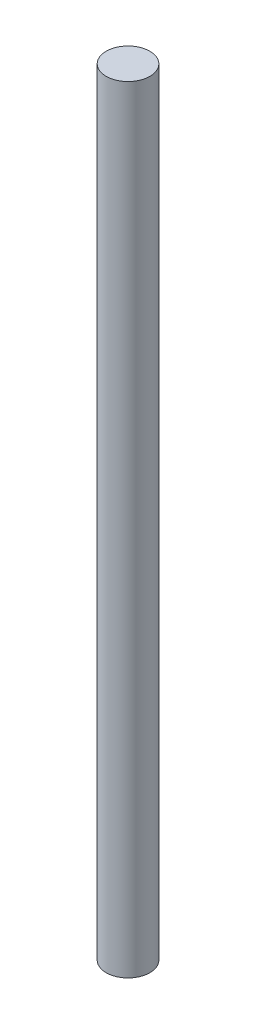
ISO-10303-21;
HEADER;
FILE_DESCRIPTION(('STEP AP214'),'2;1');
FILE_NAME('part.step','',(''),(''),'','','');
FILE_SCHEMA(('AUTOMOTIVE_DESIGN { 1 0 10303 214 1 1 1 1 }'));
ENDSEC;
DATA;
#1=APPLICATION_CONTEXT('core data for automotive mechanical design processes');
#2=APPLICATION_PROTOCOL_DEFINITION('international standard','automotive_design',2000,#1);
#3=PRODUCT_CONTEXT('',#1,'mechanical');
#4=PRODUCT('Part','Part','',(#3));
#5=PRODUCT_RELATED_PRODUCT_CATEGORY('part','',(#4));
#6=PRODUCT_DEFINITION_FORMATION('','',#4);
#7=PRODUCT_DEFINITION_CONTEXT('part definition',#1,'design');
#8=PRODUCT_DEFINITION('design','',#6,#7);
#9=PRODUCT_DEFINITION_SHAPE('','',#8);
#10=(LENGTH_UNIT() NAMED_UNIT(*) SI_UNIT(.MILLI.,.METRE.));
#11=(NAMED_UNIT(*) PLANE_ANGLE_UNIT() SI_UNIT($,.RADIAN.));
#12=(NAMED_UNIT(*) SI_UNIT($,.STERADIAN.) SOLID_ANGLE_UNIT());
#13=UNCERTAINTY_MEASURE_WITH_UNIT(LENGTH_MEASURE(1.E-05),#10,'distance_accuracy_value','');
#14=(GEOMETRIC_REPRESENTATION_CONTEXT(3) GLOBAL_UNCERTAINTY_ASSIGNED_CONTEXT((#13)) GLOBAL_UNIT_ASSIGNED_CONTEXT((#10,
#11,#12)) REPRESENTATION_CONTEXT('',''));
#15=CARTESIAN_POINT('',(0.,0.,0.));
#16=DIRECTION('',(0.,0.,1.));
#17=DIRECTION('',(1.,0.,0.));
#18=AXIS2_PLACEMENT_3D('',#15,#16,#17);
#19=CARTESIAN_POINT('',(0.,113.03,0.));
#20=DIRECTION('',(0.,-1.,0.));
#21=DIRECTION('',(0.,0.,-1.));
#22=AXIS2_PLACEMENT_3D('',#19,#20,#21);
#23=CYLINDRICAL_SURFACE('',#22,3.175);
#24=CARTESIAN_POINT('',(0.,113.03,0.));
#25=DIRECTION('',(0.,1.,0.));
#26=DIRECTION('',(0.,0.,1.));
#27=AXIS2_PLACEMENT_3D('',#24,#25,#26);
#28=CIRCLE('',#27,3.175);
#29=CARTESIAN_POINT('',(0.,113.03,-3.175));
#30=VERTEX_POINT('',#29);
#31=EDGE_CURVE('E10',#30,#30,#28,.T.);
#32=CARTESIAN_POINT('',(0.,0.,0.));
#33=DIRECTION('',(0.,1.,0.));
#34=DIRECTION('',(0.,0.,1.));
#35=AXIS2_PLACEMENT_3D('',#32,#33,#34);
#36=CIRCLE('',#35,3.175);
#37=CARTESIAN_POINT('',(0.,0.,-3.175));
#38=VERTEX_POINT('',#37);
#39=EDGE_CURVE('E44',#38,#38,#36,.T.);
#40=CARTESIAN_POINT('',(0.,113.03,-3.175));
#41=CARTESIAN_POINT('',(0.,111.852604166667,-3.175));
#42=CARTESIAN_POINT('',(0.,110.675208333333,-3.175));
#43=CARTESIAN_POINT('',(0.,108.320416666667,-3.175));
#44=CARTESIAN_POINT('',(0.,107.143020833333,-3.175));
#45=CARTESIAN_POINT('',(0.,104.788229166667,-3.175));
#46=CARTESIAN_POINT('',(0.,103.610833333333,-3.175));
#47=CARTESIAN_POINT('',(0.,101.256041666667,-3.175));
#48=CARTESIAN_POINT('',(0.,100.078645833333,-3.175));
#49=CARTESIAN_POINT('',(0.,97.7238541666667,-3.175));
#50=CARTESIAN_POINT('',(0.,96.5464583333333,-3.175));
#51=CARTESIAN_POINT('',(0.,94.1916666666667,-3.175));
#52=CARTESIAN_POINT('',(0.,93.0142708333333,-3.175));
#53=CARTESIAN_POINT('',(0.,90.6594791666667,-3.175));
#54=CARTESIAN_POINT('',(0.,89.4820833333333,-3.175));
#55=CARTESIAN_POINT('',(0.,87.1272916666667,-3.175));
#56=CARTESIAN_POINT('',(0.,85.9498958333333,-3.175));
#57=CARTESIAN_POINT('',(0.,83.5951041666667,-3.175));
#58=CARTESIAN_POINT('',(0.,82.4177083333333,-3.175));
#59=CARTESIAN_POINT('',(0.,80.0629166666667,-3.175));
#60=CARTESIAN_POINT('',(0.,78.8855208333333,-3.175));
#61=CARTESIAN_POINT('',(0.,76.5307291666667,-3.175));
#62=CARTESIAN_POINT('',(0.,75.3533333333333,-3.175));
#63=CARTESIAN_POINT('',(0.,72.9985416666667,-3.175));
#64=CARTESIAN_POINT('',(0.,71.8211458333333,-3.175));
#65=CARTESIAN_POINT('',(0.,69.4663541666667,-3.175));
#66=CARTESIAN_POINT('',(0.,68.2889583333333,-3.175));
#67=CARTESIAN_POINT('',(0.,65.9341666666667,-3.175));
#68=CARTESIAN_POINT('',(0.,64.7567708333333,-3.175));
#69=CARTESIAN_POINT('',(0.,62.4019791666667,-3.175));
#70=CARTESIAN_POINT('',(0.,61.2245833333333,-3.175));
#71=CARTESIAN_POINT('',(0.,58.8697916666667,-3.175));
#72=CARTESIAN_POINT('',(0.,57.6923958333333,-3.175));
#73=CARTESIAN_POINT('',(0.,55.3376041666667,-3.175));
#74=CARTESIAN_POINT('',(0.,54.1602083333333,-3.175));
#75=CARTESIAN_POINT('',(0.,51.8054166666667,-3.175));
#76=CARTESIAN_POINT('',(0.,50.6280208333333,-3.175));
#77=CARTESIAN_POINT('',(0.,48.2732291666667,-3.175));
#78=CARTESIAN_POINT('',(0.,47.0958333333333,-3.175));
#79=CARTESIAN_POINT('',(0.,44.7410416666667,-3.175));
#80=CARTESIAN_POINT('',(0.,43.5636458333333,-3.175));
#81=CARTESIAN_POINT('',(0.,41.2088541666667,-3.175));
#82=CARTESIAN_POINT('',(0.,40.0314583333333,-3.175));
#83=CARTESIAN_POINT('',(0.,37.6766666666667,-3.175));
#84=CARTESIAN_POINT('',(0.,36.4992708333333,-3.175));
#85=CARTESIAN_POINT('',(0.,34.1444791666667,-3.175));
#86=CARTESIAN_POINT('',(0.,32.9670833333333,-3.175));
#87=CARTESIAN_POINT('',(0.,30.6122916666667,-3.175));
#88=CARTESIAN_POINT('',(0.,29.4348958333333,-3.175));
#89=CARTESIAN_POINT('',(0.,27.0801041666667,-3.175));
#90=CARTESIAN_POINT('',(0.,25.9027083333333,-3.175));
#91=CARTESIAN_POINT('',(0.,23.5479166666667,-3.175));
#92=CARTESIAN_POINT('',(0.,22.3705208333333,-3.175));
#93=CARTESIAN_POINT('',(0.,20.0157291666667,-3.175));
#94=CARTESIAN_POINT('',(0.,18.8383333333333,-3.175));
#95=CARTESIAN_POINT('',(0.,16.4835416666667,-3.175));
#96=CARTESIAN_POINT('',(0.,15.3061458333333,-3.175));
#97=CARTESIAN_POINT('',(0.,12.9513541666667,-3.175));
#98=CARTESIAN_POINT('',(0.,11.7739583333333,-3.175));
#99=CARTESIAN_POINT('',(0.,9.41916666666667,-3.175));
#100=CARTESIAN_POINT('',(0.,8.24177083333333,-3.175));
#101=CARTESIAN_POINT('',(0.,5.88697916666667,-3.175));
#102=CARTESIAN_POINT('',(0.,4.70958333333334,-3.175));
#103=CARTESIAN_POINT('',(0.,2.35479166666667,-3.175));
#104=CARTESIAN_POINT('',(0.,1.17739583333333,-3.175));
#105=CARTESIAN_POINT('',(0.,0.,-3.175));
#106=B_SPLINE_CURVE_WITH_KNOTS('',3,(#40,#41,#42,#43,#44,#45,#46,#47,#48,#49,#50,#51,#52,#53,
#54,#55,#56,#57,#58,#59,#60,#61,#62,#63,#64,#65,#66,#67,#68,#69,#70,#71,#72,#73,#74,#75,#76,#77,
#78,#79,#80,#81,#82,#83,#84,#85,#86,#87,#88,#89,#90,#91,#92,#93,#94,#95,#96,#97,#98,#99,#100,
#101,#102,#103,#104,#105),.UNSPECIFIED.,.F.,.F.,(4,2,2,2,2,2,2,2,2,2,2,2,2,2,2,2,2,2,2,2,2,2,2,
2,2,2,2,2,2,2,2,2,4),(0.,3.53218750000001,7.06437500000001,10.5965625,14.12875,17.6609375,
21.193125,24.7253125,28.2575,31.7896875,35.321875,38.8540625,42.38625,45.9184375,49.450625,
52.9828125,56.515,60.0471875,63.579375,67.1115625,70.64375,74.1759375,77.708125,81.2403125,
84.7725,88.3046875,91.836875,95.3690625,98.90125,102.4334375,105.965625,109.4978125,113.03),.UNSPECIFIED.);
#107=EDGE_CURVE('BSEAM41',#30,#38,#106,.T.);
#108=ORIENTED_EDGE('',*,*,#31,.F.);
#109=ORIENTED_EDGE('',*,*,#39,.T.);
#110=ORIENTED_EDGE('',*,*,#107,.T.);
#111=ORIENTED_EDGE('',*,*,#107,.F.);
#112=EDGE_LOOP('',(#108,#110,#109,#111));
#113=FACE_BOUND('',#112,.T.);
#114=ADVANCED_FACE('F41',(#113),#23,.T.);
#115=CARTESIAN_POINT('',(0.,113.03,0.));
#116=DIRECTION('',(0.,1.,0.));
#117=DIRECTION('',(0.,0.,1.));
#118=AXIS2_PLACEMENT_3D('',#115,#116,#117);
#119=PLANE('',#118);
#120=ORIENTED_EDGE('',*,*,#31,.T.);
#121=EDGE_LOOP('',(#120));
#122=FACE_BOUND('',#121,.T.);
#123=ADVANCED_FACE('F58',(#122),#119,.T.);
#124=CARTESIAN_POINT('',(0.,0.,0.));
#125=DIRECTION('',(0.,1.,0.));
#126=DIRECTION('',(0.,0.,1.));
#127=AXIS2_PLACEMENT_3D('',#124,#125,#126);
#128=PLANE('',#127);
#129=ORIENTED_EDGE('',*,*,#39,.F.);
#130=EDGE_LOOP('',(#129));
#131=FACE_BOUND('',#130,.T.);
#132=ADVANCED_FACE('F56',(#131),#128,.F.);
#133=CLOSED_SHELL('',(#114,#123,#132));
#134=MANIFOLD_SOLID_BREP('B2',#133);
#135=ADVANCED_BREP_SHAPE_REPRESENTATION('',(#18,#134),#14);
#136=SHAPE_DEFINITION_REPRESENTATION(#9,#135);
ENDSEC;
END-ISO-10303-21;
